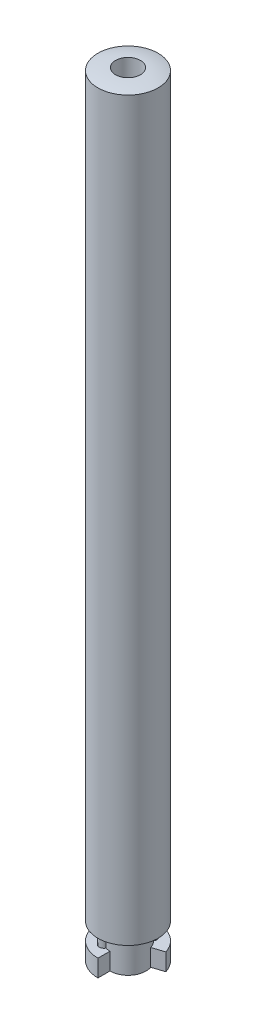
ISO-10303-21;
HEADER;
FILE_DESCRIPTION(('STEP AP214'),'2;1');
FILE_NAME('part.step','',(''),(''),'','','');
FILE_SCHEMA(('AUTOMOTIVE_DESIGN { 1 0 10303 214 1 1 1 1 }'));
ENDSEC;
DATA;
#1=APPLICATION_CONTEXT('core data for automotive mechanical design processes');
#2=APPLICATION_PROTOCOL_DEFINITION('international standard','automotive_design',2000,#1);
#3=PRODUCT_CONTEXT('',#1,'mechanical');
#4=PRODUCT('Part','Part','',(#3));
#5=PRODUCT_RELATED_PRODUCT_CATEGORY('part','',(#4));
#6=PRODUCT_DEFINITION_FORMATION('','',#4);
#7=PRODUCT_DEFINITION_CONTEXT('part definition',#1,'design');
#8=PRODUCT_DEFINITION('design','',#6,#7);
#9=PRODUCT_DEFINITION_SHAPE('','',#8);
#10=(LENGTH_UNIT() NAMED_UNIT(*) SI_UNIT(.MILLI.,.METRE.));
#11=(NAMED_UNIT(*) PLANE_ANGLE_UNIT() SI_UNIT($,.RADIAN.));
#12=(NAMED_UNIT(*) SI_UNIT($,.STERADIAN.) SOLID_ANGLE_UNIT());
#13=UNCERTAINTY_MEASURE_WITH_UNIT(LENGTH_MEASURE(1.E-05),#10,'distance_accuracy_value','');
#14=(GEOMETRIC_REPRESENTATION_CONTEXT(3) GLOBAL_UNCERTAINTY_ASSIGNED_CONTEXT((#13)) GLOBAL_UNIT_ASSIGNED_CONTEXT((#10,
#11,#12)) REPRESENTATION_CONTEXT('',''));
#15=CARTESIAN_POINT('',(0.,0.,0.));
#16=DIRECTION('',(0.,0.,1.));
#17=DIRECTION('',(1.,0.,0.));
#18=AXIS2_PLACEMENT_3D('',#15,#16,#17);
#19=CARTESIAN_POINT('',(0.,90.,0.));
#20=DIRECTION('',(0.,-1.,0.));
#21=DIRECTION('',(0.,0.,-1.));
#22=AXIS2_PLACEMENT_3D('',#19,#20,#21);
#23=CYLINDRICAL_SURFACE('',#22,3.5);
#24=CARTESIAN_POINT('',(0.,4.,0.));
#25=DIRECTION('',(0.,-1.,0.));
#26=DIRECTION('',(0.,0.,-1.));
#27=AXIS2_PLACEMENT_3D('',#24,#25,#26);
#28=CIRCLE('',#27,3.5);
#29=CARTESIAN_POINT('',(0.,3.99999999999999,-3.5));
#30=VERTEX_POINT('',#29);
#31=EDGE_CURVE('E160',#30,#30,#28,.T.);
#32=CARTESIAN_POINT('',(0.,89.7,0.));
#33=DIRECTION('',(0.,1.,0.));
#34=DIRECTION('',(0.,0.,1.));
#35=AXIS2_PLACEMENT_3D('',#32,#33,#34);
#36=CIRCLE('',#35,3.5);
#37=CARTESIAN_POINT('',(0.,89.7,-3.5));
#38=VERTEX_POINT('',#37);
#39=EDGE_CURVE('E260',#38,#38,#36,.T.);
#40=CARTESIAN_POINT('',(0.,3.99999999999999,-3.5));
#41=CARTESIAN_POINT('',(0.,4.89270833333332,-3.5));
#42=CARTESIAN_POINT('',(0.,5.78541666666666,-3.5));
#43=CARTESIAN_POINT('',(0.,7.57083333333333,-3.5));
#44=CARTESIAN_POINT('',(0.,8.46354166666666,-3.5));
#45=CARTESIAN_POINT('',(0.,10.2489583333333,-3.5));
#46=CARTESIAN_POINT('',(0.,11.1416666666667,-3.5));
#47=CARTESIAN_POINT('',(0.,12.9270833333333,-3.5));
#48=CARTESIAN_POINT('',(0.,13.8197916666667,-3.5));
#49=CARTESIAN_POINT('',(0.,15.6052083333333,-3.5));
#50=CARTESIAN_POINT('',(0.,16.4979166666667,-3.5));
#51=CARTESIAN_POINT('',(0.,18.2833333333333,-3.5));
#52=CARTESIAN_POINT('',(0.,19.1760416666667,-3.5));
#53=CARTESIAN_POINT('',(0.,20.9614583333333,-3.5));
#54=CARTESIAN_POINT('',(0.,21.8541666666667,-3.5));
#55=CARTESIAN_POINT('',(0.,23.6395833333333,-3.5));
#56=CARTESIAN_POINT('',(0.,24.5322916666667,-3.5));
#57=CARTESIAN_POINT('',(0.,26.3177083333333,-3.5));
#58=CARTESIAN_POINT('',(0.,27.2104166666667,-3.5));
#59=CARTESIAN_POINT('',(0.,28.9958333333333,-3.5));
#60=CARTESIAN_POINT('',(0.,29.8885416666667,-3.5));
#61=CARTESIAN_POINT('',(0.,31.6739583333333,-3.5));
#62=CARTESIAN_POINT('',(0.,32.5666666666667,-3.5));
#63=CARTESIAN_POINT('',(0.,34.3520833333333,-3.5));
#64=CARTESIAN_POINT('',(0.,35.2447916666667,-3.5));
#65=CARTESIAN_POINT('',(0.,37.0302083333333,-3.5));
#66=CARTESIAN_POINT('',(0.,37.9229166666667,-3.5));
#67=CARTESIAN_POINT('',(0.,39.7083333333333,-3.5));
#68=CARTESIAN_POINT('',(0.,40.6010416666667,-3.5));
#69=CARTESIAN_POINT('',(0.,42.3864583333333,-3.5));
#70=CARTESIAN_POINT('',(0.,43.2791666666667,-3.5));
#71=CARTESIAN_POINT('',(0.,45.0645833333333,-3.5));
#72=CARTESIAN_POINT('',(0.,45.9572916666667,-3.5));
#73=CARTESIAN_POINT('',(0.,47.7427083333333,-3.5));
#74=CARTESIAN_POINT('',(0.,48.6354166666667,-3.5));
#75=CARTESIAN_POINT('',(0.,50.4208333333333,-3.5));
#76=CARTESIAN_POINT('',(0.,51.3135416666667,-3.5));
#77=CARTESIAN_POINT('',(0.,53.0989583333333,-3.5));
#78=CARTESIAN_POINT('',(0.,53.9916666666667,-3.5));
#79=CARTESIAN_POINT('',(0.,55.7770833333333,-3.5));
#80=CARTESIAN_POINT('',(0.,56.6697916666667,-3.5));
#81=CARTESIAN_POINT('',(0.,58.4552083333333,-3.5));
#82=CARTESIAN_POINT('',(0.,59.3479166666667,-3.5));
#83=CARTESIAN_POINT('',(0.,61.1333333333333,-3.5));
#84=CARTESIAN_POINT('',(0.,62.0260416666667,-3.5));
#85=CARTESIAN_POINT('',(0.,63.8114583333333,-3.5));
#86=CARTESIAN_POINT('',(0.,64.7041666666667,-3.5));
#87=CARTESIAN_POINT('',(0.,66.4895833333333,-3.5));
#88=CARTESIAN_POINT('',(0.,67.3822916666666,-3.5));
#89=CARTESIAN_POINT('',(0.,69.1677083333333,-3.5));
#90=CARTESIAN_POINT('',(0.,70.0604166666667,-3.5));
#91=CARTESIAN_POINT('',(0.,71.8458333333333,-3.5));
#92=CARTESIAN_POINT('',(0.,72.7385416666667,-3.5));
#93=CARTESIAN_POINT('',(0.,74.5239583333333,-3.5));
#94=CARTESIAN_POINT('',(0.,75.4166666666666,-3.5));
#95=CARTESIAN_POINT('',(0.,77.2020833333333,-3.5));
#96=CARTESIAN_POINT('',(0.,78.0947916666667,-3.5));
#97=CARTESIAN_POINT('',(0.,79.8802083333333,-3.5));
#98=CARTESIAN_POINT('',(0.,80.7729166666666,-3.5));
#99=CARTESIAN_POINT('',(0.,82.5583333333333,-3.5));
#100=CARTESIAN_POINT('',(0.,83.4510416666667,-3.5));
#101=CARTESIAN_POINT('',(0.,85.2364583333333,-3.5));
#102=CARTESIAN_POINT('',(0.,86.1291666666666,-3.5));
#103=CARTESIAN_POINT('',(0.,87.9145833333333,-3.5));
#104=CARTESIAN_POINT('',(0.,88.8072916666666,-3.5));
#105=CARTESIAN_POINT('',(0.,89.7,-3.5));
#106=B_SPLINE_CURVE_WITH_KNOTS('',3,(#40,#41,#42,#43,#44,#45,#46,#47,#48,#49,#50,#51,#52,#53,
#54,#55,#56,#57,#58,#59,#60,#61,#62,#63,#64,#65,#66,#67,#68,#69,#70,#71,#72,#73,#74,#75,#76,#77,
#78,#79,#80,#81,#82,#83,#84,#85,#86,#87,#88,#89,#90,#91,#92,#93,#94,#95,#96,#97,#98,#99,#100,
#101,#102,#103,#104,#105),.UNSPECIFIED.,.F.,.F.,(4,2,2,2,2,2,2,2,2,2,2,2,2,2,2,2,2,2,2,2,2,2,2,
2,2,2,2,2,2,2,2,2,4),(0.,2.678125,5.35625000000001,8.034375,10.7125,13.390625,16.06875,
18.746875,21.425,24.103125,26.78125,29.459375,32.1375,34.815625,37.49375,40.171875,42.85,
45.528125,48.20625,50.884375,53.5625,56.240625,58.91875,61.596875,64.275,66.953125,69.63125,
72.309375,74.9875,77.665625,80.34375,83.021875,85.7),.UNSPECIFIED.);
#107=EDGE_CURVE('BSEAM39',#30,#38,#106,.T.);
#108=ORIENTED_EDGE('',*,*,#31,.F.);
#109=ORIENTED_EDGE('',*,*,#39,.F.);
#110=ORIENTED_EDGE('',*,*,#107,.T.);
#111=ORIENTED_EDGE('',*,*,#107,.F.);
#112=EDGE_LOOP('',(#108,#110,#109,#111));
#113=FACE_BOUND('',#112,.T.);
#114=ADVANCED_FACE('F39',(#113),#23,.T.);
#115=CARTESIAN_POINT('',(0.,2.,0.));
#116=DIRECTION('',(0.,-1.,0.));
#117=DIRECTION('',(0.,0.,-1.));
#118=AXIS2_PLACEMENT_3D('',#115,#116,#117);
#119=CYLINDRICAL_SURFACE('',#118,2.1);
#120=CARTESIAN_POINT('',(0.,2.,0.));
#121=DIRECTION('',(0.,-1.,0.));
#122=DIRECTION('',(0.,0.,-1.));
#123=AXIS2_PLACEMENT_3D('',#120,#121,#122);
#124=CIRCLE('',#123,2.1);
#125=CARTESIAN_POINT('',(1.49139224809554,2.,-1.47842793612693));
#126=VERTEX_POINT('',#125);
#127=CARTESIAN_POINT('',(1.99721868421982,2.,-0.648935688187398));
#128=VERTEX_POINT('',#127);
#129=EDGE_CURVE('E144',#126,#128,#124,.T.);
#130=ORIENTED_EDGE('',*,*,#129,.F.);
#131=DIRECTION('',(0.,-1.,0.));
#132=VECTOR('',#131,1.);
#133=CARTESIAN_POINT('',(1.49139224809554,3.,-1.47842793612693));
#134=LINE('',#133,#132);
#135=CARTESIAN_POINT('',(1.49139224809554,4.,-1.47842793612693));
#136=VERTEX_POINT('',#135);
#137=EDGE_CURVE('E130',#126,#136,#134,.F.);
#138=ORIENTED_EDGE('',*,*,#137,.T.);
#139=CARTESIAN_POINT('',(0.,4.,0.));
#140=DIRECTION('',(0.,-1.,0.));
#141=DIRECTION('',(0.,0.,-1.));
#142=AXIS2_PLACEMENT_3D('',#139,#140,#141);
#143=CIRCLE('',#142,2.1);
#144=CARTESIAN_POINT('',(-0.54351999471528,4.,2.02844423520705));
#145=VERTEX_POINT('',#144);
#146=EDGE_CURVE('E142',#136,#145,#143,.T.);
#147=ORIENTED_EDGE('',*,*,#146,.T.);
#148=DIRECTION('',(0.,-1.,0.));
#149=VECTOR('',#148,1.);
#150=CARTESIAN_POINT('',(-0.54351999471528,3.,2.02844423520705));
#151=LINE('',#150,#149);
#152=CARTESIAN_POINT('',(-0.54351999471528,2.,2.02844423520705));
#153=VERTEX_POINT('',#152);
#154=EDGE_CURVE('E48',#145,#153,#151,.T.);
#155=ORIENTED_EDGE('',*,*,#154,.T.);
#156=CARTESIAN_POINT('',(0.,2.,2.1));
#157=VERTEX_POINT('',#156);
#158=EDGE_CURVE('E156',#157,#153,#124,.T.);
#159=ORIENTED_EDGE('',*,*,#158,.F.);
#160=DIRECTION('',(0.,-1.,0.));
#161=VECTOR('',#160,1.);
#162=CARTESIAN_POINT('',(0.,2.,2.1));
#163=LINE('',#162,#161);
#164=CARTESIAN_POINT('',(0.,0.,2.1));
#165=VERTEX_POINT('',#164);
#166=EDGE_CURVE('E204',#157,#165,#163,.T.);
#167=ORIENTED_EDGE('',*,*,#166,.T.);
#168=CARTESIAN_POINT('',(0.,0.,0.));
#169=DIRECTION('',(0.,-1.,0.));
#170=DIRECTION('',(0.,0.,-1.));
#171=AXIS2_PLACEMENT_3D('',#168,#169,#170);
#172=CIRCLE('',#171,2.1);
#173=CARTESIAN_POINT('',(1.99721868421982,0.,-0.648935688187398));
#174=VERTEX_POINT('',#173);
#175=EDGE_CURVE('E183',#174,#165,#172,.T.);
#176=ORIENTED_EDGE('',*,*,#175,.F.);
#177=DIRECTION('',(0.,-1.,0.));
#178=VECTOR('',#177,1.);
#179=CARTESIAN_POINT('',(1.99721868421982,2.,-0.648935688187398));
#180=LINE('',#179,#178);
#181=EDGE_CURVE('E197',#128,#174,#180,.T.);
#182=ORIENTED_EDGE('',*,*,#181,.F.);
#183=EDGE_LOOP('',(#130,#138,#147,#155,#159,#167,#176,#182));
#184=FACE_BOUND('',#183,.T.);
#185=ADVANCED_FACE('F141',(#184),#119,.T.);
#186=CARTESIAN_POINT('',(-1.49139224809553,4.,1.47842793612694));
#187=VERTEX_POINT('',#186);
#188=CARTESIAN_POINT('',(0.543519994715295,4.,-2.02844423520704));
#189=VERTEX_POINT('',#188);
#190=EDGE_CURVE('E150',#187,#189,#143,.T.);
#191=ORIENTED_EDGE('',*,*,#190,.T.);
#192=DIRECTION('',(0.,-1.,0.));
#193=VECTOR('',#192,1.);
#194=CARTESIAN_POINT('',(0.543519994715294,3.,-2.02844423520704));
#195=LINE('',#194,#193);
#196=CARTESIAN_POINT('',(0.543519994715294,2.,-2.02844423520704));
#197=VERTEX_POINT('',#196);
#198=EDGE_CURVE('E55',#189,#197,#195,.T.);
#199=ORIENTED_EDGE('',*,*,#198,.T.);
#200=CARTESIAN_POINT('',(-1.29886816183054E-13,2.,-2.1));
#201=VERTEX_POINT('',#200);
#202=EDGE_CURVE('E151',#201,#197,#124,.T.);
#203=ORIENTED_EDGE('',*,*,#202,.F.);
#204=DIRECTION('',(0.,-1.,0.));
#205=VECTOR('',#204,1.);
#206=CARTESIAN_POINT('',(-1.29886816183054E-13,2.,-2.1));
#207=LINE('',#206,#205);
#208=CARTESIAN_POINT('',(-1.29886816183054E-13,0.,-2.1));
#209=VERTEX_POINT('',#208);
#210=EDGE_CURVE('E180',#201,#209,#207,.T.);
#211=ORIENTED_EDGE('',*,*,#210,.T.);
#212=CARTESIAN_POINT('',(0.,0.,0.));
#213=DIRECTION('',(0.,-1.,0.));
#214=DIRECTION('',(0.,0.,-1.));
#215=AXIS2_PLACEMENT_3D('',#212,#213,#214);
#216=CIRCLE('',#215,2.1);
#217=CARTESIAN_POINT('',(-1.99721868421978,0.,0.648935688187523));
#218=VERTEX_POINT('',#217);
#219=EDGE_CURVE('E163',#218,#209,#216,.T.);
#220=ORIENTED_EDGE('',*,*,#219,.F.);
#221=DIRECTION('',(0.,-1.,0.));
#222=VECTOR('',#221,1.);
#223=CARTESIAN_POINT('',(-1.99721868421978,2.,0.648935688187523));
#224=LINE('',#223,#222);
#225=CARTESIAN_POINT('',(-1.99721868421978,2.,0.648935688187523));
#226=VERTEX_POINT('',#225);
#227=EDGE_CURVE('E173',#226,#218,#224,.T.);
#228=ORIENTED_EDGE('',*,*,#227,.F.);
#229=CARTESIAN_POINT('',(-1.49139224809553,2.,1.47842793612694));
#230=VERTEX_POINT('',#229);
#231=EDGE_CURVE('E253',#230,#226,#124,.T.);
#232=ORIENTED_EDGE('',*,*,#231,.F.);
#233=DIRECTION('',(0.,-1.,0.));
#234=VECTOR('',#233,1.);
#235=CARTESIAN_POINT('',(-1.49139224809553,3.,1.47842793612695));
#236=LINE('',#235,#234);
#237=EDGE_CURVE('E11',#230,#187,#236,.F.);
#238=ORIENTED_EDGE('',*,*,#237,.T.);
#239=EDGE_LOOP('',(#191,#199,#203,#211,#220,#228,#232,#238));
#240=FACE_BOUND('',#239,.T.);
#241=ADVANCED_FACE('F234',(#240),#119,.T.);
#242=CARTESIAN_POINT('',(0.,2.,0.));
#243=DIRECTION('',(0.,-1.,0.));
#244=DIRECTION('',(0.,0.,-1.));
#245=AXIS2_PLACEMENT_3D('',#242,#243,#244);
#246=PLANE('',#245);
#247=CARTESIAN_POINT('',(1.02599233253928,2.,-1.76814699095529));
#248=DIRECTION('',(0.,1.,0.));
#249=DIRECTION('',(0.,0.,1.));
#250=AXIS2_PLACEMENT_3D('',#247,#248,#249);
#251=CIRCLE('',#250,0.548210007324203);
#252=EDGE_CURVE('E136',#126,#197,#251,.T.);
#253=ORIENTED_EDGE('',*,*,#252,.F.);
#254=ORIENTED_EDGE('',*,*,#129,.T.);
#255=DIRECTION('',(0.951056516295152,0.,-0.309016994374951));
#256=VECTOR('',#255,1.);
#257=CARTESIAN_POINT('',(0.,2.,0.));
#258=LINE('',#257,#256);
#259=CARTESIAN_POINT('',(3.32869780703303,2.,-1.08155948031233));
#260=VERTEX_POINT('',#259);
#261=EDGE_CURVE('E191',#128,#260,#258,.T.);
#262=ORIENTED_EDGE('',*,*,#261,.T.);
#263=CARTESIAN_POINT('',(0.,2.,0.));
#264=DIRECTION('',(0.,-1.,0.));
#265=DIRECTION('',(0.,0.,-1.));
#266=AXIS2_PLACEMENT_3D('',#263,#264,#265);
#267=CIRCLE('',#266,3.5);
#268=CARTESIAN_POINT('',(0.,2.,-3.5));
#269=VERTEX_POINT('',#268);
#270=EDGE_CURVE('E164',#269,#260,#267,.T.);
#271=ORIENTED_EDGE('',*,*,#270,.F.);
#272=DIRECTION('',(0.,0.,-1.));
#273=VECTOR('',#272,1.);
#274=CARTESIAN_POINT('',(0.,2.,0.));
#275=LINE('',#274,#273);
#276=EDGE_CURVE('E169',#201,#269,#275,.T.);
#277=ORIENTED_EDGE('',*,*,#276,.F.);
#278=ORIENTED_EDGE('',*,*,#202,.T.);
#279=EDGE_LOOP('',(#253,#254,#262,#271,#277,#278));
#280=FACE_BOUND('',#279,.T.);
#281=ADVANCED_FACE('F238',(#280),#246,.F.);
#282=CARTESIAN_POINT('',(0.,4.,0.));
#283=DIRECTION('',(0.,-1.,0.));
#284=DIRECTION('',(0.,0.,-1.));
#285=AXIS2_PLACEMENT_3D('',#282,#283,#284);
#286=PLANE('',#285);
#287=ORIENTED_EDGE('',*,*,#146,.F.);
#288=CARTESIAN_POINT('',(1.02599233253928,4.,-1.76814699095529));
#289=DIRECTION('',(0.,1.,0.));
#290=DIRECTION('',(0.,0.,1.));
#291=AXIS2_PLACEMENT_3D('',#288,#289,#290);
#292=CIRCLE('',#291,0.548210007324203);
#293=EDGE_CURVE('E127',#136,#189,#292,.T.);
#294=ORIENTED_EDGE('',*,*,#293,.T.);
#295=ORIENTED_EDGE('',*,*,#190,.F.);
#296=CARTESIAN_POINT('',(-1.02599233253927,4.,1.76814699095529));
#297=DIRECTION('',(0.,1.,0.));
#298=DIRECTION('',(0.,0.,1.));
#299=AXIS2_PLACEMENT_3D('',#296,#297,#298);
#300=CIRCLE('',#299,0.548210007324203);
#301=EDGE_CURVE('E149',#187,#145,#300,.T.);
#302=ORIENTED_EDGE('',*,*,#301,.T.);
#303=EDGE_LOOP('',(#287,#294,#295,#302));
#304=FACE_BOUND('',#303,.T.);
#305=ORIENTED_EDGE('',*,*,#31,.T.);
#306=EDGE_LOOP('',(#305));
#307=FACE_BOUND('',#306,.T.);
#308=ADVANCED_FACE('F147',(#304,#307),#286,.T.);
#309=CARTESIAN_POINT('',(-1.02599233253927,2.,1.76814699095529));
#310=DIRECTION('',(0.,1.,0.));
#311=DIRECTION('',(0.,0.,1.));
#312=AXIS2_PLACEMENT_3D('',#309,#310,#311);
#313=CIRCLE('',#312,0.548210007324203);
#314=EDGE_CURVE('E63',#230,#153,#313,.T.);
#315=ORIENTED_EDGE('',*,*,#314,.F.);
#316=ORIENTED_EDGE('',*,*,#231,.T.);
#317=DIRECTION('',(-0.951056516295133,0.,0.309016994375011));
#318=VECTOR('',#317,1.);
#319=CARTESIAN_POINT('',(0.,2.,0.));
#320=LINE('',#319,#318);
#321=CARTESIAN_POINT('',(-3.32869780703297,2.,1.08155948031254));
#322=VERTEX_POINT('',#321);
#323=EDGE_CURVE('E167',#226,#322,#320,.T.);
#324=ORIENTED_EDGE('',*,*,#323,.T.);
#325=CARTESIAN_POINT('',(0.,2.,3.5));
#326=VERTEX_POINT('',#325);
#327=EDGE_CURVE('E153',#326,#322,#267,.T.);
#328=ORIENTED_EDGE('',*,*,#327,.F.);
#329=DIRECTION('',(0.,0.,1.));
#330=VECTOR('',#329,1.);
#331=CARTESIAN_POINT('',(0.,2.,0.));
#332=LINE('',#331,#330);
#333=EDGE_CURVE('E193',#157,#326,#332,.T.);
#334=ORIENTED_EDGE('',*,*,#333,.F.);
#335=ORIENTED_EDGE('',*,*,#158,.T.);
#336=EDGE_LOOP('',(#315,#316,#324,#328,#334,#335));
#337=FACE_BOUND('',#336,.T.);
#338=ADVANCED_FACE('F289',(#337),#246,.F.);
#339=CARTESIAN_POINT('',(0.,0.,0.));
#340=DIRECTION('',(0.,1.,0.));
#341=DIRECTION('',(0.,0.,1.));
#342=AXIS2_PLACEMENT_3D('',#339,#340,#341);
#343=PLANE('',#342);
#344=DIRECTION('',(0.,0.,-1.));
#345=VECTOR('',#344,1.);
#346=CARTESIAN_POINT('',(0.,0.,0.));
#347=LINE('',#346,#345);
#348=CARTESIAN_POINT('',(-2.16478026971757E-13,0.,-3.5));
#349=VERTEX_POINT('',#348);
#350=EDGE_CURVE('E170',#209,#349,#347,.T.);
#351=ORIENTED_EDGE('',*,*,#350,.T.);
#352=CARTESIAN_POINT('',(0.,0.,0.));
#353=DIRECTION('',(0.,1.,0.));
#354=DIRECTION('',(0.,0.,1.));
#355=AXIS2_PLACEMENT_3D('',#352,#353,#354);
#356=CIRCLE('',#355,3.5);
#357=CARTESIAN_POINT('',(3.32869780703303,0.,-1.08155948031233));
#358=VERTEX_POINT('',#357);
#359=EDGE_CURVE('E217',#358,#349,#356,.T.);
#360=ORIENTED_EDGE('',*,*,#359,.F.);
#361=DIRECTION('',(0.951056516295152,0.,-0.309016994374951));
#362=VECTOR('',#361,1.);
#363=CARTESIAN_POINT('',(0.,0.,0.));
#364=LINE('',#363,#362);
#365=EDGE_CURVE('E200',#174,#358,#364,.T.);
#366=ORIENTED_EDGE('',*,*,#365,.F.);
#367=ORIENTED_EDGE('',*,*,#175,.T.);
#368=DIRECTION('',(0.,0.,1.));
#369=VECTOR('',#368,1.);
#370=CARTESIAN_POINT('',(0.,0.,0.));
#371=LINE('',#370,#369);
#372=CARTESIAN_POINT('',(0.,0.,3.5));
#373=VERTEX_POINT('',#372);
#374=EDGE_CURVE('E194',#165,#373,#371,.T.);
#375=ORIENTED_EDGE('',*,*,#374,.T.);
#376=CARTESIAN_POINT('',(-3.32869780703297,0.,1.08155948031254));
#377=VERTEX_POINT('',#376);
#378=EDGE_CURVE('E207',#377,#373,#356,.T.);
#379=ORIENTED_EDGE('',*,*,#378,.F.);
#380=DIRECTION('',(-0.951056516295133,0.,0.309016994375011));
#381=VECTOR('',#380,1.);
#382=CARTESIAN_POINT('',(0.,0.,0.));
#383=LINE('',#382,#381);
#384=EDGE_CURVE('E176',#218,#377,#383,.T.);
#385=ORIENTED_EDGE('',*,*,#384,.F.);
#386=ORIENTED_EDGE('',*,*,#219,.T.);
#387=EDGE_LOOP('',(#351,#360,#366,#367,#375,#379,#385,#386));
#388=FACE_BOUND('',#387,.T.);
#389=ADVANCED_FACE('F228',(#388),#343,.F.);
#390=CARTESIAN_POINT('',(0.,2.,0.));
#391=DIRECTION('',(0.309016994375011,0.,0.951056516295133));
#392=DIRECTION('',(0.951056516295133,0.,-0.309016994375011));
#393=AXIS2_PLACEMENT_3D('',#390,#391,#392);
#394=PLANE('',#393);
#395=ORIENTED_EDGE('',*,*,#384,.T.);
#396=DIRECTION('',(0.,-1.,0.));
#397=VECTOR('',#396,1.);
#398=CARTESIAN_POINT('',(-3.32869780703297,2.,1.08155948031254));
#399=LINE('',#398,#397);
#400=EDGE_CURVE('E186',#322,#377,#399,.T.);
#401=ORIENTED_EDGE('',*,*,#400,.F.);
#402=ORIENTED_EDGE('',*,*,#323,.F.);
#403=ORIENTED_EDGE('',*,*,#227,.T.);
#404=EDGE_LOOP('',(#395,#401,#402,#403));
#405=FACE_BOUND('',#404,.T.);
#406=ADVANCED_FACE('F251',(#405),#394,.F.);
#407=CARTESIAN_POINT('',(0.,2.,0.));
#408=DIRECTION('',(-1.,0.,0.));
#409=DIRECTION('',(0.,0.,1.));
#410=AXIS2_PLACEMENT_3D('',#407,#408,#409);
#411=PLANE('',#410);
#412=ORIENTED_EDGE('',*,*,#350,.F.);
#413=ORIENTED_EDGE('',*,*,#210,.F.);
#414=ORIENTED_EDGE('',*,*,#276,.T.);
#415=DIRECTION('',(0.,-1.,0.));
#416=VECTOR('',#415,1.);
#417=CARTESIAN_POINT('',(-2.16478026971757E-13,2.,-3.5));
#418=LINE('',#417,#416);
#419=EDGE_CURVE('E184',#269,#349,#418,.T.);
#420=ORIENTED_EDGE('',*,*,#419,.T.);
#421=EDGE_LOOP('',(#412,#413,#414,#420));
#422=FACE_BOUND('',#421,.T.);
#423=ADVANCED_FACE('F232',(#422),#411,.T.);
#424=CARTESIAN_POINT('',(0.,2.,0.));
#425=DIRECTION('',(-0.309016994374952,0.,-0.951056516295152));
#426=DIRECTION('',(-0.951056516295152,0.,0.309016994374952));
#427=AXIS2_PLACEMENT_3D('',#424,#425,#426);
#428=PLANE('',#427);
#429=ORIENTED_EDGE('',*,*,#365,.T.);
#430=DIRECTION('',(0.,-1.,0.));
#431=VECTOR('',#430,1.);
#432=CARTESIAN_POINT('',(3.32869780703303,2.,-1.08155948031233));
#433=LINE('',#432,#431);
#434=EDGE_CURVE('E210',#260,#358,#433,.T.);
#435=ORIENTED_EDGE('',*,*,#434,.F.);
#436=ORIENTED_EDGE('',*,*,#261,.F.);
#437=ORIENTED_EDGE('',*,*,#181,.T.);
#438=EDGE_LOOP('',(#429,#435,#436,#437));
#439=FACE_BOUND('',#438,.T.);
#440=ADVANCED_FACE('F241',(#439),#428,.F.);
#441=CARTESIAN_POINT('',(0.,2.,0.));
#442=DIRECTION('',(1.,0.,0.));
#443=DIRECTION('',(0.,0.,-1.));
#444=AXIS2_PLACEMENT_3D('',#441,#442,#443);
#445=PLANE('',#444);
#446=ORIENTED_EDGE('',*,*,#374,.F.);
#447=ORIENTED_EDGE('',*,*,#166,.F.);
#448=ORIENTED_EDGE('',*,*,#333,.T.);
#449=DIRECTION('',(0.,-1.,0.));
#450=VECTOR('',#449,1.);
#451=CARTESIAN_POINT('',(0.,2.,3.5));
#452=LINE('',#451,#450);
#453=EDGE_CURVE('E208',#326,#373,#452,.T.);
#454=ORIENTED_EDGE('',*,*,#453,.T.);
#455=EDGE_LOOP('',(#446,#447,#448,#454));
#456=FACE_BOUND('',#455,.T.);
#457=ADVANCED_FACE('F298',(#456),#445,.T.);
#458=ORIENTED_EDGE('',*,*,#453,.F.);
#459=ORIENTED_EDGE('',*,*,#327,.T.);
#460=ORIENTED_EDGE('',*,*,#400,.T.);
#461=ORIENTED_EDGE('',*,*,#378,.T.);
#462=EDGE_LOOP('',(#458,#459,#460,#461));
#463=FACE_BOUND('',#462,.T.);
#464=ADVANCED_FACE('F41',(#463),#23,.T.);
#465=ORIENTED_EDGE('',*,*,#419,.F.);
#466=ORIENTED_EDGE('',*,*,#270,.T.);
#467=ORIENTED_EDGE('',*,*,#434,.T.);
#468=ORIENTED_EDGE('',*,*,#359,.T.);
#469=EDGE_LOOP('',(#465,#466,#467,#468));
#470=FACE_BOUND('',#469,.T.);
#471=ADVANCED_FACE('F224',(#470),#23,.T.);
#472=CARTESIAN_POINT('',(-1.02599233253927,4.,1.76814699095529));
#473=DIRECTION('',(0.,-1.,0.));
#474=DIRECTION('',(0.,0.,-1.));
#475=AXIS2_PLACEMENT_3D('',#472,#473,#474);
#476=CYLINDRICAL_SURFACE('',#475,0.548210007324203);
#477=ORIENTED_EDGE('',*,*,#237,.F.);
#478=ORIENTED_EDGE('',*,*,#314,.T.);
#479=ORIENTED_EDGE('',*,*,#154,.F.);
#480=ORIENTED_EDGE('',*,*,#301,.F.);
#481=EDGE_LOOP('',(#477,#478,#479,#480));
#482=FACE_BOUND('',#481,.T.);
#483=ADVANCED_FACE('F284',(#482),#476,.T.);
#484=CARTESIAN_POINT('',(1.02599233253928,4.,-1.76814699095529));
#485=DIRECTION('',(0.,-1.,0.));
#486=DIRECTION('',(0.,0.,-1.));
#487=AXIS2_PLACEMENT_3D('',#484,#485,#486);
#488=CYLINDRICAL_SURFACE('',#487,0.548210007324203);
#489=ORIENTED_EDGE('',*,*,#137,.F.);
#490=ORIENTED_EDGE('',*,*,#252,.T.);
#491=ORIENTED_EDGE('',*,*,#198,.F.);
#492=ORIENTED_EDGE('',*,*,#293,.F.);
#493=EDGE_LOOP('',(#489,#490,#491,#492));
#494=FACE_BOUND('',#493,.T.);
#495=ADVANCED_FACE('F129',(#494),#488,.T.);
#496=CARTESIAN_POINT('',(1.39498477695491,89.9992743464965,0.));
#497=CARTESIAN_POINT('',(2.10892297441147,89.9886015776092,0.));
#498=CARTESIAN_POINT('',(2.81059471542264,89.8888434621104,0.));
#499=CARTESIAN_POINT('',(3.5,89.7,0.));
#500=B_SPLINE_CURVE_WITH_KNOTS('',3,(#496,#497,#498,#499),.UNSPECIFIED.,.F.,.F.,(4,4),(0.,
0.91789501144442),.UNSPECIFIED.);
#501=CARTESIAN_POINT('',(0.,107.628853610651,0.));
#502=DIRECTION('',(0.,1.,0.));
#503=AXIS1_PLACEMENT('',#501,#502);
#504=SURFACE_OF_REVOLUTION('',#500,#503);
#505=ORIENTED_EDGE('',*,*,#39,.T.);
#506=EDGE_LOOP('',(#505));
#507=FACE_BOUND('',#506,.T.);
#508=CARTESIAN_POINT('',(0.,89.9982750652549,0.));
#509=DIRECTION('',(0.,1.,0.));
#510=DIRECTION('',(0.,0.,1.));
#511=AXIS2_PLACEMENT_3D('',#508,#509,#510);
#512=CIRCLE('',#511,1.45);
#513=CARTESIAN_POINT('',(0.,89.9982750652549,1.45));
#514=VERTEX_POINT('',#513);
#515=EDGE_CURVE('E43',#514,#514,#512,.F.);
#516=ORIENTED_EDGE('',*,*,#515,.T.);
#517=EDGE_LOOP('',(#516));
#518=FACE_BOUND('',#517,.T.);
#519=ADVANCED_FACE('F270',(#507,#518),#504,.F.);
#520=CARTESIAN_POINT('',(0.,80.,0.));
#521=DIRECTION('',(0.,1.,0.));
#522=DIRECTION('',(0.,0.,1.));
#523=AXIS2_PLACEMENT_3D('',#520,#521,#522);
#524=PLANE('',#523);
#525=CARTESIAN_POINT('',(0.,80.,0.));
#526=DIRECTION('',(0.,1.,0.));
#527=DIRECTION('',(0.,0.,1.));
#528=AXIS2_PLACEMENT_3D('',#525,#526,#527);
#529=CIRCLE('',#528,1.45);
#530=CARTESIAN_POINT('',(0.,80.,1.45));
#531=VERTEX_POINT('',#530);
#532=EDGE_CURVE('E137',#531,#531,#529,.T.);
#533=ORIENTED_EDGE('',*,*,#532,.T.);
#534=EDGE_LOOP('',(#533));
#535=FACE_BOUND('',#534,.T.);
#536=ADVANCED_FACE('F273',(#535),#524,.T.);
#537=CARTESIAN_POINT('',(0.,80.,0.));
#538=DIRECTION('',(0.,1.,0.));
#539=DIRECTION('',(0.,0.,1.));
#540=AXIS2_PLACEMENT_3D('',#537,#538,#539);
#541=CYLINDRICAL_SURFACE('',#540,1.45);
#542=ORIENTED_EDGE('',*,*,#532,.F.);
#543=EDGE_LOOP('',(#542));
#544=FACE_BOUND('',#543,.T.);
#545=ORIENTED_EDGE('',*,*,#515,.F.);
#546=EDGE_LOOP('',(#545));
#547=FACE_BOUND('',#546,.T.);
#548=ADVANCED_FACE('F277',(#544,#547),#541,.F.);
#549=CLOSED_SHELL('',(#114,#185,#241,#281,#308,#338,#389,#406,#423,#440,#457,#464,#471,#483,
#495,#519,#536,#548));
#550=MANIFOLD_SOLID_BREP('B2',#549);
#551=ADVANCED_BREP_SHAPE_REPRESENTATION('',(#18,#550),#14);
#552=SHAPE_DEFINITION_REPRESENTATION(#9,#551);
ENDSEC;
END-ISO-10303-21;
